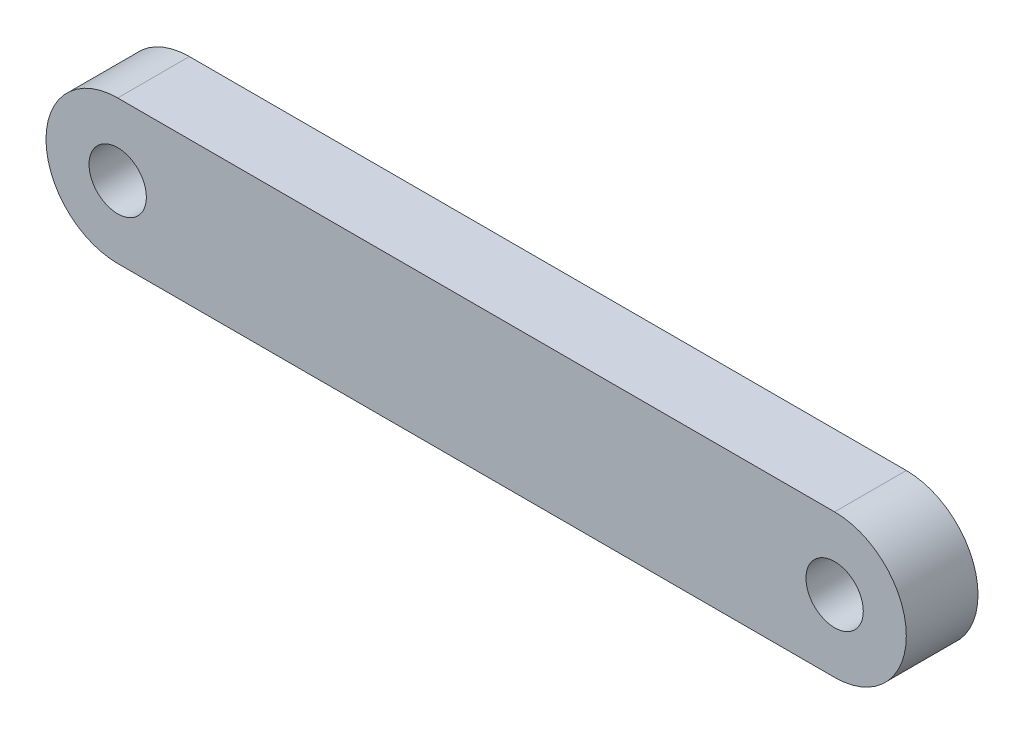
ISO-10303-21;
HEADER;
FILE_DESCRIPTION(('STEP AP214'),'2;1');
FILE_NAME('part.step','',(''),(''),'','','');
FILE_SCHEMA(('AUTOMOTIVE_DESIGN { 1 0 10303 214 1 1 1 1 }'));
ENDSEC;
DATA;
#1=APPLICATION_CONTEXT('core data for automotive mechanical design processes');
#2=APPLICATION_PROTOCOL_DEFINITION('international standard','automotive_design',2000,#1);
#3=PRODUCT_CONTEXT('',#1,'mechanical');
#4=PRODUCT('Part','Part','',(#3));
#5=PRODUCT_RELATED_PRODUCT_CATEGORY('part','',(#4));
#6=PRODUCT_DEFINITION_FORMATION('','',#4);
#7=PRODUCT_DEFINITION_CONTEXT('part definition',#1,'design');
#8=PRODUCT_DEFINITION('design','',#6,#7);
#9=PRODUCT_DEFINITION_SHAPE('','',#8);
#10=(LENGTH_UNIT() NAMED_UNIT(*) SI_UNIT(.MILLI.,.METRE.));
#11=(NAMED_UNIT(*) PLANE_ANGLE_UNIT() SI_UNIT($,.RADIAN.));
#12=(NAMED_UNIT(*) SI_UNIT($,.STERADIAN.) SOLID_ANGLE_UNIT());
#13=UNCERTAINTY_MEASURE_WITH_UNIT(LENGTH_MEASURE(1.E-05),#10,'distance_accuracy_value','');
#14=(GEOMETRIC_REPRESENTATION_CONTEXT(3) GLOBAL_UNCERTAINTY_ASSIGNED_CONTEXT((#13)) GLOBAL_UNIT_ASSIGNED_CONTEXT((#10,
#11,#12)) REPRESENTATION_CONTEXT('',''));
#15=CARTESIAN_POINT('',(0.,0.,0.));
#16=DIRECTION('',(0.,0.,1.));
#17=DIRECTION('',(1.,0.,0.));
#18=AXIS2_PLACEMENT_3D('',#15,#16,#17);
#19=CARTESIAN_POINT('',(-25.,0.,2.5));
#20=DIRECTION('',(0.,0.,1.));
#21=DIRECTION('',(1.,0.,0.));
#22=AXIS2_PLACEMENT_3D('',#19,#20,#21);
#23=PLANE('',#22);
#24=CARTESIAN_POINT('',(25.,0.,2.5));
#25=DIRECTION('',(0.,0.,1.));
#26=DIRECTION('',(1.,0.,0.));
#27=AXIS2_PLACEMENT_3D('',#24,#25,#26);
#28=CIRCLE('',#27,2.);
#29=CARTESIAN_POINT('',(27.,0.,2.5));
#30=VERTEX_POINT('',#29);
#31=EDGE_CURVE('E112',#30,#30,#28,.T.);
#32=ORIENTED_EDGE('',*,*,#31,.F.);
#33=EDGE_LOOP('',(#32));
#34=FACE_BOUND('',#33,.T.);
#35=CARTESIAN_POINT('',(-25.,0.,2.5));
#36=DIRECTION('',(0.,0.,1.));
#37=DIRECTION('',(1.,0.,0.));
#38=AXIS2_PLACEMENT_3D('',#35,#36,#37);
#39=CIRCLE('',#38,5.);
#40=CARTESIAN_POINT('',(-25.,5.,2.5));
#41=VERTEX_POINT('',#40);
#42=CARTESIAN_POINT('',(-25.,-5.,2.5));
#43=VERTEX_POINT('',#42);
#44=EDGE_CURVE('E92',#41,#43,#39,.T.);
#45=ORIENTED_EDGE('',*,*,#44,.T.);
#46=DIRECTION('',(1.,0.,0.));
#47=VECTOR('',#46,1.);
#48=CARTESIAN_POINT('',(-25.,-5.,2.5));
#49=LINE('',#48,#47);
#50=CARTESIAN_POINT('',(25.,-5.,2.5));
#51=VERTEX_POINT('',#50);
#52=EDGE_CURVE('E87',#43,#51,#49,.T.);
#53=ORIENTED_EDGE('',*,*,#52,.T.);
#54=CARTESIAN_POINT('',(25.,0.,2.5));
#55=DIRECTION('',(0.,0.,1.));
#56=DIRECTION('',(1.,0.,0.));
#57=AXIS2_PLACEMENT_3D('',#54,#55,#56);
#58=CIRCLE('',#57,5.);
#59=CARTESIAN_POINT('',(25.,5.00000000000001,2.5));
#60=VERTEX_POINT('',#59);
#61=EDGE_CURVE('E90',#51,#60,#58,.T.);
#62=ORIENTED_EDGE('',*,*,#61,.T.);
#63=DIRECTION('',(-1.,0.,0.));
#64=VECTOR('',#63,1.);
#65=CARTESIAN_POINT('',(-25.,5.,2.5));
#66=LINE('',#65,#64);
#67=EDGE_CURVE('E57',#60,#41,#66,.T.);
#68=ORIENTED_EDGE('',*,*,#67,.T.);
#69=EDGE_LOOP('',(#45,#53,#62,#68));
#70=FACE_BOUND('',#69,.T.);
#71=CARTESIAN_POINT('',(-25.,0.,2.5));
#72=DIRECTION('',(0.,0.,1.));
#73=DIRECTION('',(1.,0.,0.));
#74=AXIS2_PLACEMENT_3D('',#71,#72,#73);
#75=CIRCLE('',#74,2.);
#76=CARTESIAN_POINT('',(-23.,0.,2.5));
#77=VERTEX_POINT('',#76);
#78=EDGE_CURVE('E134',#77,#77,#75,.T.);
#79=ORIENTED_EDGE('',*,*,#78,.F.);
#80=EDGE_LOOP('',(#79));
#81=FACE_BOUND('',#80,.T.);
#82=ADVANCED_FACE('F39',(#34,#70,#81),#23,.T.);
#83=CARTESIAN_POINT('',(-25.,0.,-2.5));
#84=DIRECTION('',(0.,0.,1.));
#85=DIRECTION('',(1.,0.,0.));
#86=AXIS2_PLACEMENT_3D('',#83,#84,#85);
#87=PLANE('',#86);
#88=CARTESIAN_POINT('',(-25.,0.,-2.5));
#89=DIRECTION('',(0.,0.,1.));
#90=DIRECTION('',(1.,0.,0.));
#91=AXIS2_PLACEMENT_3D('',#88,#89,#90);
#92=CIRCLE('',#91,5.);
#93=CARTESIAN_POINT('',(-25.,5.,-2.5));
#94=VERTEX_POINT('',#93);
#95=CARTESIAN_POINT('',(-25.,-5.,-2.5));
#96=VERTEX_POINT('',#95);
#97=EDGE_CURVE('E108',#94,#96,#92,.T.);
#98=ORIENTED_EDGE('',*,*,#97,.F.);
#99=DIRECTION('',(-1.,0.,0.));
#100=VECTOR('',#99,1.);
#101=CARTESIAN_POINT('',(-25.,5.,-2.5));
#102=LINE('',#101,#100);
#103=CARTESIAN_POINT('',(25.,5.00000000000001,-2.5));
#104=VERTEX_POINT('',#103);
#105=EDGE_CURVE('E80',#104,#94,#102,.T.);
#106=ORIENTED_EDGE('',*,*,#105,.F.);
#107=CARTESIAN_POINT('',(25.,0.,-2.5));
#108=DIRECTION('',(0.,0.,1.));
#109=DIRECTION('',(1.,0.,0.));
#110=AXIS2_PLACEMENT_3D('',#107,#108,#109);
#111=CIRCLE('',#110,5.);
#112=CARTESIAN_POINT('',(25.,-5.,-2.5));
#113=VERTEX_POINT('',#112);
#114=EDGE_CURVE('E74',#113,#104,#111,.T.);
#115=ORIENTED_EDGE('',*,*,#114,.F.);
#116=DIRECTION('',(1.,0.,0.));
#117=VECTOR('',#116,1.);
#118=CARTESIAN_POINT('',(-25.,-5.,-2.5));
#119=LINE('',#118,#117);
#120=EDGE_CURVE('E97',#96,#113,#119,.T.);
#121=ORIENTED_EDGE('',*,*,#120,.F.);
#122=EDGE_LOOP('',(#98,#106,#115,#121));
#123=FACE_BOUND('',#122,.T.);
#124=CARTESIAN_POINT('',(25.,0.,-2.5));
#125=DIRECTION('',(0.,0.,1.));
#126=DIRECTION('',(1.,0.,0.));
#127=AXIS2_PLACEMENT_3D('',#124,#125,#126);
#128=CIRCLE('',#127,2.);
#129=CARTESIAN_POINT('',(27.,0.,-2.5));
#130=VERTEX_POINT('',#129);
#131=EDGE_CURVE('E130',#130,#130,#128,.T.);
#132=ORIENTED_EDGE('',*,*,#131,.T.);
#133=EDGE_LOOP('',(#132));
#134=FACE_BOUND('',#133,.T.);
#135=CARTESIAN_POINT('',(-25.,0.,-2.5));
#136=DIRECTION('',(0.,0.,1.));
#137=DIRECTION('',(1.,0.,0.));
#138=AXIS2_PLACEMENT_3D('',#135,#136,#137);
#139=CIRCLE('',#138,2.);
#140=CARTESIAN_POINT('',(-23.,0.,-2.5));
#141=VERTEX_POINT('',#140);
#142=EDGE_CURVE('E138',#141,#141,#139,.T.);
#143=ORIENTED_EDGE('',*,*,#142,.T.);
#144=EDGE_LOOP('',(#143));
#145=FACE_BOUND('',#144,.T.);
#146=ADVANCED_FACE('F125',(#123,#134,#145),#87,.F.);
#147=CARTESIAN_POINT('',(-25.,0.,2.5));
#148=DIRECTION('',(0.,0.,-1.));
#149=DIRECTION('',(-1.,0.,0.));
#150=AXIS2_PLACEMENT_3D('',#147,#148,#149);
#151=CYLINDRICAL_SURFACE('',#150,5.);
#152=ORIENTED_EDGE('',*,*,#97,.T.);
#153=DIRECTION('',(0.,0.,-1.));
#154=VECTOR('',#153,1.);
#155=CARTESIAN_POINT('',(-25.,-5.,2.5));
#156=LINE('',#155,#154);
#157=EDGE_CURVE('E11',#43,#96,#156,.T.);
#158=ORIENTED_EDGE('',*,*,#157,.F.);
#159=ORIENTED_EDGE('',*,*,#44,.F.);
#160=DIRECTION('',(0.,0.,-1.));
#161=VECTOR('',#160,1.);
#162=CARTESIAN_POINT('',(-25.,5.,2.5));
#163=LINE('',#162,#161);
#164=EDGE_CURVE('E104',#41,#94,#163,.T.);
#165=ORIENTED_EDGE('',*,*,#164,.T.);
#166=EDGE_LOOP('',(#152,#158,#159,#165));
#167=FACE_BOUND('',#166,.T.);
#168=ADVANCED_FACE('F41',(#167),#151,.T.);
#169=CARTESIAN_POINT('',(-25.,-5.,2.5));
#170=DIRECTION('',(0.,1.,0.));
#171=DIRECTION('',(-1.,0.,0.));
#172=AXIS2_PLACEMENT_3D('',#169,#170,#171);
#173=PLANE('',#172);
#174=ORIENTED_EDGE('',*,*,#120,.T.);
#175=DIRECTION('',(0.,0.,-1.));
#176=VECTOR('',#175,1.);
#177=CARTESIAN_POINT('',(25.,-5.,2.5));
#178=LINE('',#177,#176);
#179=EDGE_CURVE('E49',#51,#113,#178,.T.);
#180=ORIENTED_EDGE('',*,*,#179,.F.);
#181=ORIENTED_EDGE('',*,*,#52,.F.);
#182=ORIENTED_EDGE('',*,*,#157,.T.);
#183=EDGE_LOOP('',(#174,#180,#181,#182));
#184=FACE_BOUND('',#183,.T.);
#185=ADVANCED_FACE('F96',(#184),#173,.F.);
#186=CARTESIAN_POINT('',(25.,0.,2.5));
#187=DIRECTION('',(0.,0.,-1.));
#188=DIRECTION('',(-1.,0.,0.));
#189=AXIS2_PLACEMENT_3D('',#186,#187,#188);
#190=CYLINDRICAL_SURFACE('',#189,5.);
#191=ORIENTED_EDGE('',*,*,#114,.T.);
#192=DIRECTION('',(0.,0.,-1.));
#193=VECTOR('',#192,1.);
#194=CARTESIAN_POINT('',(25.,5.00000000000001,2.5));
#195=LINE('',#194,#193);
#196=EDGE_CURVE('E99',#60,#104,#195,.T.);
#197=ORIENTED_EDGE('',*,*,#196,.F.);
#198=ORIENTED_EDGE('',*,*,#61,.F.);
#199=ORIENTED_EDGE('',*,*,#179,.T.);
#200=EDGE_LOOP('',(#191,#197,#198,#199));
#201=FACE_BOUND('',#200,.T.);
#202=ADVANCED_FACE('F100',(#201),#190,.T.);
#203=CARTESIAN_POINT('',(-25.,5.,2.5));
#204=DIRECTION('',(0.,-1.,0.));
#205=DIRECTION('',(1.,0.,0.));
#206=AXIS2_PLACEMENT_3D('',#203,#204,#205);
#207=PLANE('',#206);
#208=ORIENTED_EDGE('',*,*,#105,.T.);
#209=ORIENTED_EDGE('',*,*,#164,.F.);
#210=ORIENTED_EDGE('',*,*,#67,.F.);
#211=ORIENTED_EDGE('',*,*,#196,.T.);
#212=EDGE_LOOP('',(#208,#209,#210,#211));
#213=FACE_BOUND('',#212,.T.);
#214=ADVANCED_FACE('F122',(#213),#207,.F.);
#215=CARTESIAN_POINT('',(25.,0.,2.5));
#216=DIRECTION('',(0.,0.,-1.));
#217=DIRECTION('',(-1.,0.,0.));
#218=AXIS2_PLACEMENT_3D('',#215,#216,#217);
#219=CYLINDRICAL_SURFACE('',#218,2.);
#220=ORIENTED_EDGE('',*,*,#31,.T.);
#221=EDGE_LOOP('',(#220));
#222=FACE_BOUND('',#221,.T.);
#223=ORIENTED_EDGE('',*,*,#131,.F.);
#224=EDGE_LOOP('',(#223));
#225=FACE_BOUND('',#224,.T.);
#226=ADVANCED_FACE('F157',(#222,#225),#219,.F.);
#227=CARTESIAN_POINT('',(-25.,0.,2.5));
#228=DIRECTION('',(0.,0.,-1.));
#229=DIRECTION('',(-1.,0.,0.));
#230=AXIS2_PLACEMENT_3D('',#227,#228,#229);
#231=CYLINDRICAL_SURFACE('',#230,2.);
#232=ORIENTED_EDGE('',*,*,#78,.T.);
#233=EDGE_LOOP('',(#232));
#234=FACE_BOUND('',#233,.T.);
#235=ORIENTED_EDGE('',*,*,#142,.F.);
#236=EDGE_LOOP('',(#235));
#237=FACE_BOUND('',#236,.T.);
#238=ADVANCED_FACE('F146',(#234,#237),#231,.F.);
#239=CLOSED_SHELL('',(#82,#146,#168,#185,#202,#214,#226,#238));
#240=MANIFOLD_SOLID_BREP('B2',#239);
#241=ADVANCED_BREP_SHAPE_REPRESENTATION('',(#18,#240),#14);
#242=SHAPE_DEFINITION_REPRESENTATION(#9,#241);
ENDSEC;
END-ISO-10303-21;
